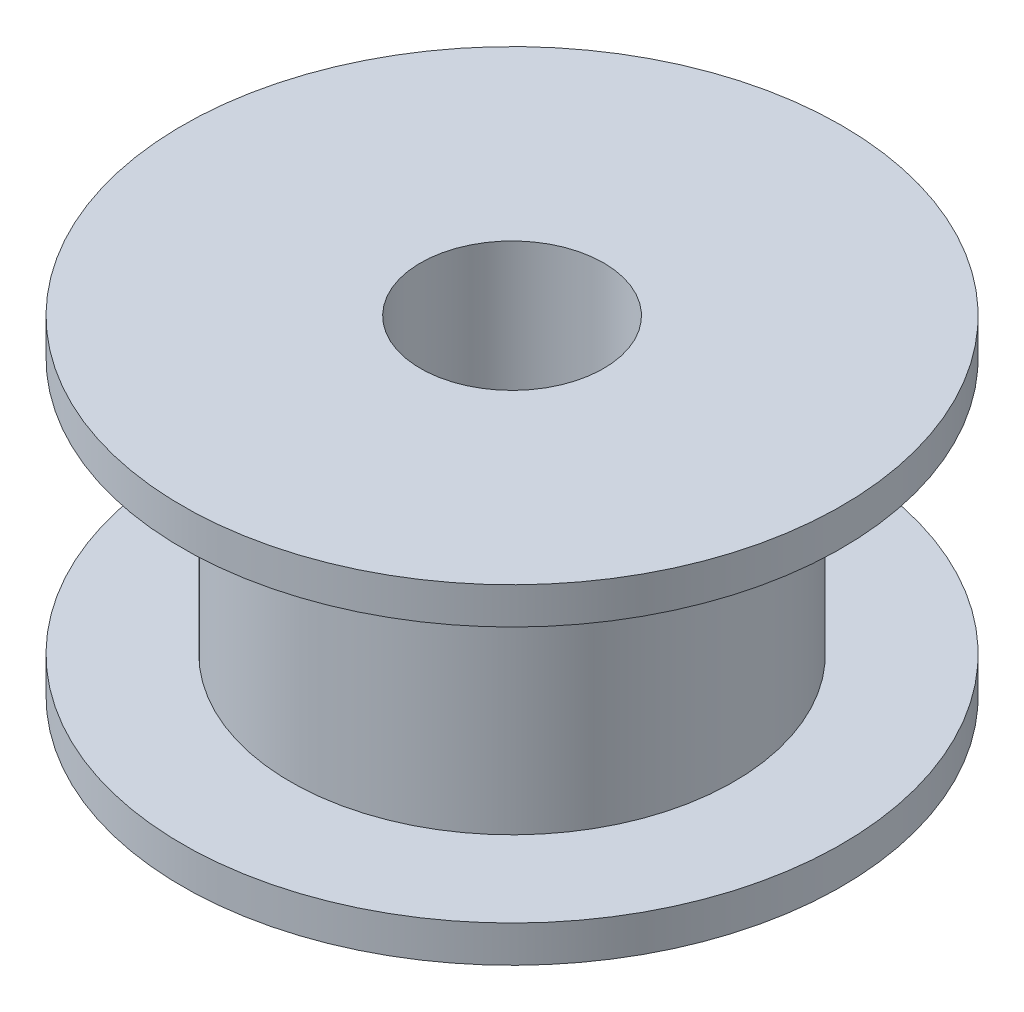
ISO-10303-21;
HEADER;
FILE_DESCRIPTION(('STEP AP214'),'2;1');
FILE_NAME('part.step','',(''),(''),'','','');
FILE_SCHEMA(('AUTOMOTIVE_DESIGN { 1 0 10303 214 1 1 1 1 }'));
ENDSEC;
DATA;
#1=APPLICATION_CONTEXT('core data for automotive mechanical design processes');
#2=APPLICATION_PROTOCOL_DEFINITION('international standard','automotive_design',2000,#1);
#3=PRODUCT_CONTEXT('',#1,'mechanical');
#4=PRODUCT('Part','Part','',(#3));
#5=PRODUCT_RELATED_PRODUCT_CATEGORY('part','',(#4));
#6=PRODUCT_DEFINITION_FORMATION('','',#4);
#7=PRODUCT_DEFINITION_CONTEXT('part definition',#1,'design');
#8=PRODUCT_DEFINITION('design','',#6,#7);
#9=PRODUCT_DEFINITION_SHAPE('','',#8);
#10=(LENGTH_UNIT() NAMED_UNIT(*) SI_UNIT(.MILLI.,.METRE.));
#11=(NAMED_UNIT(*) PLANE_ANGLE_UNIT() SI_UNIT($,.RADIAN.));
#12=(NAMED_UNIT(*) SI_UNIT($,.STERADIAN.) SOLID_ANGLE_UNIT());
#13=UNCERTAINTY_MEASURE_WITH_UNIT(LENGTH_MEASURE(1.E-05),#10,'distance_accuracy_value','');
#14=(GEOMETRIC_REPRESENTATION_CONTEXT(3) GLOBAL_UNCERTAINTY_ASSIGNED_CONTEXT((#13)) GLOBAL_UNIT_ASSIGNED_CONTEXT((#10,
#11,#12)) REPRESENTATION_CONTEXT('',''));
#15=CARTESIAN_POINT('',(0.,0.,0.));
#16=DIRECTION('',(0.,0.,1.));
#17=DIRECTION('',(1.,0.,0.));
#18=AXIS2_PLACEMENT_3D('',#15,#16,#17);
#19=CARTESIAN_POINT('',(0.,0.,0.));
#20=DIRECTION('',(0.,-1.,0.));
#21=DIRECTION('',(0.,0.,-1.));
#22=AXIS2_PLACEMENT_3D('',#19,#20,#21);
#23=CYLINDRICAL_SURFACE('',#22,2.5);
#24=CARTESIAN_POINT('',(0.,9.,0.));
#25=DIRECTION('',(0.,-1.,0.));
#26=DIRECTION('',(0.,0.,-1.));
#27=AXIS2_PLACEMENT_3D('',#24,#25,#26);
#28=CIRCLE('',#27,2.5);
#29=CARTESIAN_POINT('',(0.,9.,-2.5));
#30=VERTEX_POINT('',#29);
#31=EDGE_CURVE('E65',#30,#30,#28,.T.);
#32=ORIENTED_EDGE('',*,*,#31,.F.);
#33=EDGE_LOOP('',(#32));
#34=FACE_BOUND('',#33,.T.);
#35=CARTESIAN_POINT('',(0.,0.,0.));
#36=DIRECTION('',(0.,-1.,0.));
#37=DIRECTION('',(0.,0.,-1.));
#38=AXIS2_PLACEMENT_3D('',#35,#36,#37);
#39=CIRCLE('',#38,2.5);
#40=CARTESIAN_POINT('',(0.,0.,-2.5));
#41=VERTEX_POINT('',#40);
#42=EDGE_CURVE('E10',#41,#41,#39,.T.);
#43=ORIENTED_EDGE('',*,*,#42,.T.);
#44=EDGE_LOOP('',(#43));
#45=FACE_BOUND('',#44,.T.);
#46=ADVANCED_FACE('F37',(#34,#45),#23,.F.);
#47=CARTESIAN_POINT('',(-2.5,0.,0.));
#48=DIRECTION('',(0.,1.,0.));
#49=DIRECTION('',(0.,0.,1.));
#50=AXIS2_PLACEMENT_3D('',#47,#48,#49);
#51=PLANE('',#50);
#52=ORIENTED_EDGE('',*,*,#42,.F.);
#53=EDGE_LOOP('',(#52));
#54=FACE_BOUND('',#53,.T.);
#55=CARTESIAN_POINT('',(0.,0.,0.));
#56=DIRECTION('',(0.,-1.,0.));
#57=DIRECTION('',(0.,0.,-1.));
#58=AXIS2_PLACEMENT_3D('',#55,#56,#57);
#59=CIRCLE('',#58,9.);
#60=CARTESIAN_POINT('',(0.,0.,-9.));
#61=VERTEX_POINT('',#60);
#62=EDGE_CURVE('E43',#61,#61,#59,.T.);
#63=ORIENTED_EDGE('',*,*,#62,.T.);
#64=EDGE_LOOP('',(#63));
#65=FACE_BOUND('',#64,.T.);
#66=ADVANCED_FACE('F72',(#54,#65),#51,.F.);
#67=CARTESIAN_POINT('',(0.,0.,0.));
#68=DIRECTION('',(0.,-1.,0.));
#69=DIRECTION('',(0.,0.,-1.));
#70=AXIS2_PLACEMENT_3D('',#67,#68,#69);
#71=CYLINDRICAL_SURFACE('',#70,9.);
#72=ORIENTED_EDGE('',*,*,#62,.F.);
#73=EDGE_LOOP('',(#72));
#74=FACE_BOUND('',#73,.T.);
#75=CARTESIAN_POINT('',(0.,1.,0.));
#76=DIRECTION('',(0.,-1.,0.));
#77=DIRECTION('',(0.,0.,-1.));
#78=AXIS2_PLACEMENT_3D('',#75,#76,#77);
#79=CIRCLE('',#78,9.);
#80=CARTESIAN_POINT('',(0.,1.,-9.));
#81=VERTEX_POINT('',#80);
#82=EDGE_CURVE('E47',#81,#81,#79,.T.);
#83=ORIENTED_EDGE('',*,*,#82,.T.);
#84=EDGE_LOOP('',(#83));
#85=FACE_BOUND('',#84,.T.);
#86=ADVANCED_FACE('F76',(#74,#85),#71,.T.);
#87=CARTESIAN_POINT('',(-9.,1.,0.));
#88=DIRECTION('',(0.,-1.,0.));
#89=DIRECTION('',(0.,0.,-1.));
#90=AXIS2_PLACEMENT_3D('',#87,#88,#89);
#91=PLANE('',#90);
#92=ORIENTED_EDGE('',*,*,#82,.F.);
#93=EDGE_LOOP('',(#92));
#94=FACE_BOUND('',#93,.T.);
#95=CARTESIAN_POINT('',(0.,1.,0.));
#96=DIRECTION('',(0.,-1.,0.));
#97=DIRECTION('',(0.,0.,-1.));
#98=AXIS2_PLACEMENT_3D('',#95,#96,#97);
#99=CIRCLE('',#98,6.05);
#100=CARTESIAN_POINT('',(0.,1.,-6.05));
#101=VERTEX_POINT('',#100);
#102=EDGE_CURVE('E51',#101,#101,#99,.T.);
#103=ORIENTED_EDGE('',*,*,#102,.T.);
#104=EDGE_LOOP('',(#103));
#105=FACE_BOUND('',#104,.T.);
#106=ADVANCED_FACE('F81',(#94,#105),#91,.F.);
#107=CARTESIAN_POINT('',(0.,0.,0.));
#108=DIRECTION('',(0.,-1.,0.));
#109=DIRECTION('',(0.,0.,-1.));
#110=AXIS2_PLACEMENT_3D('',#107,#108,#109);
#111=CYLINDRICAL_SURFACE('',#110,6.05);
#112=ORIENTED_EDGE('',*,*,#102,.F.);
#113=EDGE_LOOP('',(#112));
#114=FACE_BOUND('',#113,.T.);
#115=CARTESIAN_POINT('',(0.,8.,0.));
#116=DIRECTION('',(0.,-1.,0.));
#117=DIRECTION('',(0.,0.,-1.));
#118=AXIS2_PLACEMENT_3D('',#115,#116,#117);
#119=CIRCLE('',#118,6.05);
#120=CARTESIAN_POINT('',(0.,8.,-6.05));
#121=VERTEX_POINT('',#120);
#122=EDGE_CURVE('E56',#121,#121,#119,.T.);
#123=ORIENTED_EDGE('',*,*,#122,.T.);
#124=EDGE_LOOP('',(#123));
#125=FACE_BOUND('',#124,.T.);
#126=ADVANCED_FACE('F87',(#114,#125),#111,.T.);
#127=CARTESIAN_POINT('',(-6.05,8.,0.));
#128=DIRECTION('',(0.,1.,0.));
#129=DIRECTION('',(0.,0.,1.));
#130=AXIS2_PLACEMENT_3D('',#127,#128,#129);
#131=PLANE('',#130);
#132=ORIENTED_EDGE('',*,*,#122,.F.);
#133=EDGE_LOOP('',(#132));
#134=FACE_BOUND('',#133,.T.);
#135=CARTESIAN_POINT('',(0.,8.,0.));
#136=DIRECTION('',(0.,-1.,0.));
#137=DIRECTION('',(0.,0.,-1.));
#138=AXIS2_PLACEMENT_3D('',#135,#136,#137);
#139=CIRCLE('',#138,9.);
#140=CARTESIAN_POINT('',(0.,8.,-9.));
#141=VERTEX_POINT('',#140);
#142=EDGE_CURVE('E59',#141,#141,#139,.T.);
#143=ORIENTED_EDGE('',*,*,#142,.T.);
#144=EDGE_LOOP('',(#143));
#145=FACE_BOUND('',#144,.T.);
#146=ADVANCED_FACE('F91',(#134,#145),#131,.F.);
#147=CARTESIAN_POINT('',(0.,0.,0.));
#148=DIRECTION('',(0.,-1.,0.));
#149=DIRECTION('',(0.,0.,-1.));
#150=AXIS2_PLACEMENT_3D('',#147,#148,#149);
#151=CYLINDRICAL_SURFACE('',#150,9.);
#152=ORIENTED_EDGE('',*,*,#142,.F.);
#153=EDGE_LOOP('',(#152));
#154=FACE_BOUND('',#153,.T.);
#155=CARTESIAN_POINT('',(0.,9.,0.));
#156=DIRECTION('',(0.,-1.,0.));
#157=DIRECTION('',(0.,0.,-1.));
#158=AXIS2_PLACEMENT_3D('',#155,#156,#157);
#159=CIRCLE('',#158,9.);
#160=CARTESIAN_POINT('',(0.,9.,-9.));
#161=VERTEX_POINT('',#160);
#162=EDGE_CURVE('E62',#161,#161,#159,.T.);
#163=ORIENTED_EDGE('',*,*,#162,.T.);
#164=EDGE_LOOP('',(#163));
#165=FACE_BOUND('',#164,.T.);
#166=ADVANCED_FACE('F95',(#154,#165),#151,.T.);
#167=CARTESIAN_POINT('',(-9.,9.,0.));
#168=DIRECTION('',(0.,-1.,0.));
#169=DIRECTION('',(0.,0.,-1.));
#170=AXIS2_PLACEMENT_3D('',#167,#168,#169);
#171=PLANE('',#170);
#172=ORIENTED_EDGE('',*,*,#162,.F.);
#173=EDGE_LOOP('',(#172));
#174=FACE_BOUND('',#173,.T.);
#175=ORIENTED_EDGE('',*,*,#31,.T.);
#176=EDGE_LOOP('',(#175));
#177=FACE_BOUND('',#176,.T.);
#178=ADVANCED_FACE('F69',(#174,#177),#171,.F.);
#179=CLOSED_SHELL('',(#46,#66,#86,#106,#126,#146,#166,#178));
#180=MANIFOLD_SOLID_BREP('B2',#179);
#181=ADVANCED_BREP_SHAPE_REPRESENTATION('',(#18,#180),#14);
#182=SHAPE_DEFINITION_REPRESENTATION(#9,#181);
ENDSEC;
END-ISO-10303-21;
